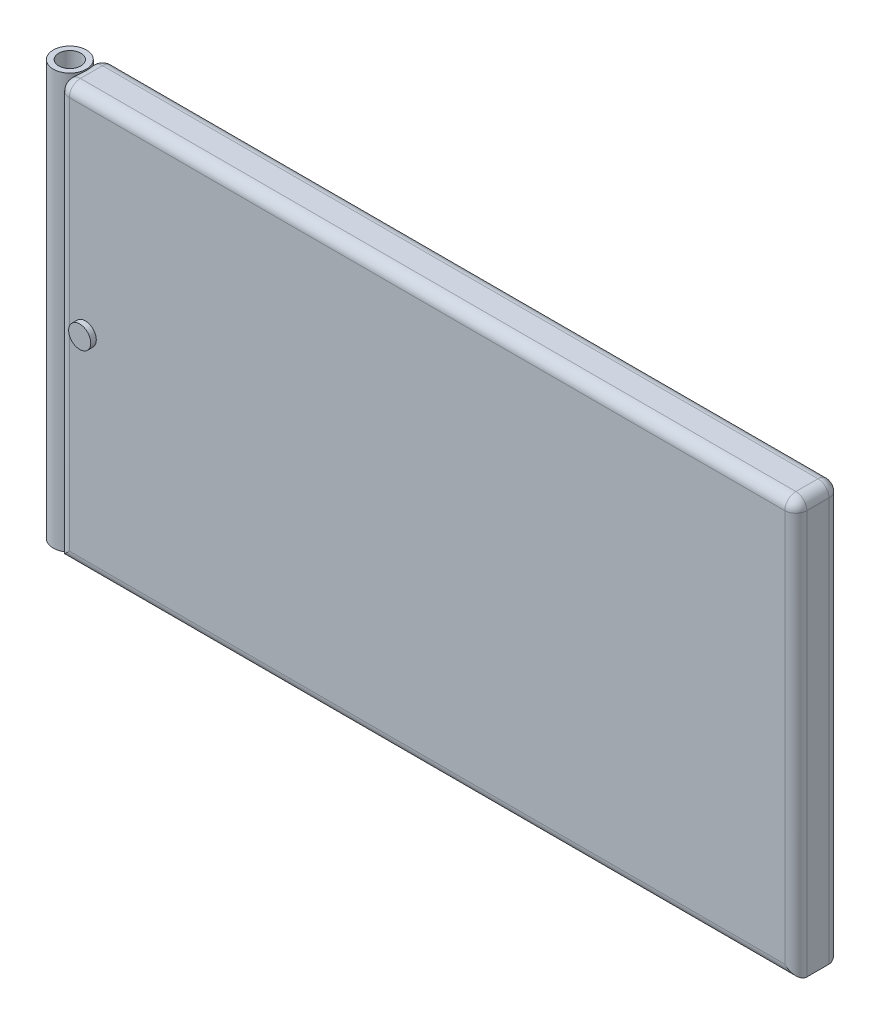
ISO-10303-21;
HEADER;
FILE_DESCRIPTION(('STEP AP214'),'2;1');
FILE_NAME('part.step','',(''),(''),'','','');
FILE_SCHEMA(('AUTOMOTIVE_DESIGN { 1 0 10303 214 1 1 1 1 }'));
ENDSEC;
DATA;
#1=APPLICATION_CONTEXT('core data for automotive mechanical design processes');
#2=APPLICATION_PROTOCOL_DEFINITION('international standard','automotive_design',2000,#1);
#3=PRODUCT_CONTEXT('',#1,'mechanical');
#4=PRODUCT('Part','Part','',(#3));
#5=PRODUCT_RELATED_PRODUCT_CATEGORY('part','',(#4));
#6=PRODUCT_DEFINITION_FORMATION('','',#4);
#7=PRODUCT_DEFINITION_CONTEXT('part definition',#1,'design');
#8=PRODUCT_DEFINITION('design','',#6,#7);
#9=PRODUCT_DEFINITION_SHAPE('','',#8);
#10=(LENGTH_UNIT() NAMED_UNIT(*) SI_UNIT(.MILLI.,.METRE.));
#11=(NAMED_UNIT(*) PLANE_ANGLE_UNIT() SI_UNIT($,.RADIAN.));
#12=(NAMED_UNIT(*) SI_UNIT($,.STERADIAN.) SOLID_ANGLE_UNIT());
#13=UNCERTAINTY_MEASURE_WITH_UNIT(LENGTH_MEASURE(1.E-05),#10,'distance_accuracy_value','');
#14=(GEOMETRIC_REPRESENTATION_CONTEXT(3) GLOBAL_UNCERTAINTY_ASSIGNED_CONTEXT((#13)) GLOBAL_UNIT_ASSIGNED_CONTEXT((#10,
#11,#12)) REPRESENTATION_CONTEXT('',''));
#15=CARTESIAN_POINT('',(0.,0.,0.));
#16=DIRECTION('',(0.,0.,1.));
#17=DIRECTION('',(1.,0.,0.));
#18=AXIS2_PLACEMENT_3D('',#15,#16,#17);
#19=CARTESIAN_POINT('',(-857.185714285714,219.297678571429,20.));
#20=DIRECTION('',(-1.,0.,0.));
#21=DIRECTION('',(0.,0.,1.));
#22=AXIS2_PLACEMENT_3D('',#19,#20,#21);
#23=CYLINDRICAL_SURFACE('',#22,20.);
#24=DIRECTION('',(-1.,0.,0.));
#25=VECTOR('',#24,1.);
#26=CARTESIAN_POINT('',(-857.185714285714,239.297678571429,20.));
#27=LINE('',#26,#25);
#28=CARTESIAN_POINT('',(456.214285714286,239.297678571429,20.));
#29=VERTEX_POINT('',#28);
#30=CARTESIAN_POINT('',(-837.185714285714,239.297678571429,20.));
#31=VERTEX_POINT('',#30);
#32=EDGE_CURVE('E198',#29,#31,#27,.T.);
#33=ORIENTED_EDGE('',*,*,#32,.F.);
#34=CARTESIAN_POINT('',(456.214285714286,219.297678571429,20.));
#35=DIRECTION('',(-1.,0.,0.));
#36=DIRECTION('',(0.,0.,1.));
#37=AXIS2_PLACEMENT_3D('',#34,#35,#36);
#38=CIRCLE('',#37,20.);
#39=CARTESIAN_POINT('',(456.214285714286,219.297678571429,0.));
#40=VERTEX_POINT('',#39);
#41=EDGE_CURVE('E230',#29,#40,#38,.T.);
#42=ORIENTED_EDGE('',*,*,#41,.T.);
#43=DIRECTION('',(-1.,0.,0.));
#44=VECTOR('',#43,1.);
#45=CARTESIAN_POINT('',(0.,219.297678571429,0.));
#46=LINE('',#45,#44);
#47=CARTESIAN_POINT('',(-837.185714285714,219.297678571429,0.));
#48=VERTEX_POINT('',#47);
#49=EDGE_CURVE('E203',#48,#40,#46,.F.);
#50=ORIENTED_EDGE('',*,*,#49,.F.);
#51=CARTESIAN_POINT('',(-837.185714285714,219.297678571429,20.));
#52=DIRECTION('',(-1.,0.,0.));
#53=DIRECTION('',(0.,0.,1.));
#54=AXIS2_PLACEMENT_3D('',#51,#52,#53);
#55=CIRCLE('',#54,20.);
#56=EDGE_CURVE('E228',#48,#31,#55,.F.);
#57=ORIENTED_EDGE('',*,*,#56,.T.);
#58=EDGE_LOOP('',(#33,#42,#50,#57));
#59=FACE_BOUND('',#58,.T.);
#60=ADVANCED_FACE('F41',(#59),#23,.T.);
#61=CARTESIAN_POINT('',(-857.185714285714,-510.702321428571,80.));
#62=DIRECTION('',(0.,1.,0.));
#63=DIRECTION('',(0.,0.,1.));
#64=AXIS2_PLACEMENT_3D('',#61,#62,#63);
#65=PLANE('',#64);
#66=CARTESIAN_POINT('',(-876.240324270766,-510.702321428572,40.));
#67=DIRECTION('',(0.,1.,0.));
#68=DIRECTION('',(0.,0.,1.));
#69=AXIS2_PLACEMENT_3D('',#66,#67,#68);
#70=CIRCLE('',#69,20.0000000000001);
#71=CARTESIAN_POINT('',(-876.240324270766,-510.702321428572,60.0000000000001));
#72=VERTEX_POINT('',#71);
#73=EDGE_CURVE('E304',#72,#72,#70,.T.);
#74=ORIENTED_EDGE('',*,*,#73,.T.);
#75=EDGE_LOOP('',(#74));
#76=FACE_BOUND('',#75,.T.);
#77=DIRECTION('',(1.,0.,0.));
#78=VECTOR('',#77,1.);
#79=CARTESIAN_POINT('',(-857.185714285714,-510.702321428571,60.));
#80=LINE('',#79,#78);
#81=CARTESIAN_POINT('',(476.214285714286,-510.702321428571,60.));
#82=VERTEX_POINT('',#81);
#83=CARTESIAN_POINT('',(-853.879644495769,-510.702321428572,60.));
#84=VERTEX_POINT('',#83);
#85=EDGE_CURVE('E56',#82,#84,#80,.F.);
#86=ORIENTED_EDGE('',*,*,#85,.T.);
#87=CARTESIAN_POINT('',(-876.240324270766,-510.702321428572,40.));
#88=DIRECTION('',(0.,1.,0.));
#89=DIRECTION('',(0.,0.,1.));
#90=AXIS2_PLACEMENT_3D('',#87,#88,#89);
#91=CIRCLE('',#90,30.);
#92=CARTESIAN_POINT('',(-853.879644495769,-510.702321428571,20.));
#93=VERTEX_POINT('',#92);
#94=EDGE_CURVE('E63',#93,#84,#91,.T.);
#95=ORIENTED_EDGE('',*,*,#94,.F.);
#96=DIRECTION('',(1.,0.,0.));
#97=VECTOR('',#96,1.);
#98=CARTESIAN_POINT('',(-857.185714285714,-510.702321428571,20.));
#99=LINE('',#98,#97);
#100=CARTESIAN_POINT('',(476.214285714286,-510.702321428571,20.));
#101=VERTEX_POINT('',#100);
#102=EDGE_CURVE('E159',#93,#101,#99,.T.);
#103=ORIENTED_EDGE('',*,*,#102,.T.);
#104=DIRECTION('',(0.,0.,-1.));
#105=VECTOR('',#104,1.);
#106=CARTESIAN_POINT('',(476.214285714286,-510.702321428571,80.));
#107=LINE('',#106,#105);
#108=EDGE_CURVE('E158',#82,#101,#107,.T.);
#109=ORIENTED_EDGE('',*,*,#108,.F.);
#110=EDGE_LOOP('',(#86,#95,#103,#109));
#111=FACE_BOUND('',#110,.T.);
#112=ADVANCED_FACE('F156',(#76,#111),#65,.F.);
#113=CARTESIAN_POINT('',(476.214285714286,239.297678571429,80.));
#114=DIRECTION('',(-1.,0.,0.));
#115=DIRECTION('',(0.,-1.,0.));
#116=AXIS2_PLACEMENT_3D('',#113,#114,#115);
#117=PLANE('',#116);
#118=ORIENTED_EDGE('',*,*,#108,.T.);
#119=DIRECTION('',(0.,1.,0.));
#120=VECTOR('',#119,1.);
#121=CARTESIAN_POINT('',(476.214285714286,239.297678571429,20.));
#122=LINE('',#121,#120);
#123=CARTESIAN_POINT('',(476.214285714286,219.297678571429,20.));
#124=VERTEX_POINT('',#123);
#125=EDGE_CURVE('E226',#101,#124,#122,.T.);
#126=ORIENTED_EDGE('',*,*,#125,.T.);
#127=DIRECTION('',(0.,0.,-1.));
#128=VECTOR('',#127,1.);
#129=CARTESIAN_POINT('',(476.214285714286,219.297678571429,80.));
#130=LINE('',#129,#128);
#131=CARTESIAN_POINT('',(476.214285714286,219.297678571429,60.));
#132=VERTEX_POINT('',#131);
#133=EDGE_CURVE('E223',#124,#132,#130,.F.);
#134=ORIENTED_EDGE('',*,*,#133,.T.);
#135=DIRECTION('',(0.,1.,0.));
#136=VECTOR('',#135,1.);
#137=CARTESIAN_POINT('',(476.214285714286,-510.702321428571,60.));
#138=LINE('',#137,#136);
#139=EDGE_CURVE('E221',#132,#82,#138,.F.);
#140=ORIENTED_EDGE('',*,*,#139,.T.);
#141=EDGE_LOOP('',(#118,#126,#134,#140));
#142=FACE_BOUND('',#141,.T.);
#143=ADVANCED_FACE('F335',(#142),#117,.F.);
#144=CARTESIAN_POINT('',(-857.185714285714,239.297678571429,80.));
#145=DIRECTION('',(0.,-1.,0.));
#146=DIRECTION('',(0.,0.,-1.));
#147=AXIS2_PLACEMENT_3D('',#144,#145,#146);
#148=PLANE('',#147);
#149=DIRECTION('',(-1.,0.,0.));
#150=VECTOR('',#149,1.);
#151=CARTESIAN_POINT('',(476.214285714286,239.297678571429,60.));
#152=LINE('',#151,#150);
#153=CARTESIAN_POINT('',(-837.185714285714,239.297678571429,60.));
#154=VERTEX_POINT('',#153);
#155=CARTESIAN_POINT('',(456.214285714286,239.297678571429,60.));
#156=VERTEX_POINT('',#155);
#157=EDGE_CURVE('E214',#154,#156,#152,.F.);
#158=ORIENTED_EDGE('',*,*,#157,.T.);
#159=DIRECTION('',(0.,0.,-1.));
#160=VECTOR('',#159,1.);
#161=CARTESIAN_POINT('',(456.214285714286,239.297678571429,80.));
#162=LINE('',#161,#160);
#163=EDGE_CURVE('E218',#156,#29,#162,.T.);
#164=ORIENTED_EDGE('',*,*,#163,.T.);
#165=ORIENTED_EDGE('',*,*,#32,.T.);
#166=DIRECTION('',(0.,0.,-1.));
#167=VECTOR('',#166,1.);
#168=CARTESIAN_POINT('',(-837.185714285714,239.297678571429,80.));
#169=LINE('',#168,#167);
#170=EDGE_CURVE('E216',#31,#154,#169,.F.);
#171=ORIENTED_EDGE('',*,*,#170,.T.);
#172=EDGE_LOOP('',(#158,#164,#165,#171));
#173=FACE_BOUND('',#172,.T.);
#174=ADVANCED_FACE('F328',(#173),#148,.F.);
#175=CARTESIAN_POINT('',(0.,0.,80.));
#176=DIRECTION('',(0.,0.,1.));
#177=DIRECTION('',(1.,0.,0.));
#178=AXIS2_PLACEMENT_3D('',#175,#176,#177);
#179=PLANE('',#178);
#180=CARTESIAN_POINT('',(-808.39323953068,-135.702321428571,80.));
#181=DIRECTION('',(0.,0.,1.));
#182=DIRECTION('',(1.,0.,0.));
#183=AXIS2_PLACEMENT_3D('',#180,#181,#182);
#184=CIRCLE('',#183,20.);
#185=CARTESIAN_POINT('',(-788.39323953068,-135.702321428571,80.));
#186=VERTEX_POINT('',#185);
#187=EDGE_CURVE('E312',#186,#186,#184,.T.);
#188=ORIENTED_EDGE('',*,*,#187,.F.);
#189=EDGE_LOOP('',(#188));
#190=FACE_BOUND('',#189,.T.);
#191=DIRECTION('',(0.,-1.,0.));
#192=VECTOR('',#191,1.);
#193=CARTESIAN_POINT('',(-837.185714285714,-510.702321428571,80.));
#194=LINE('',#193,#192);
#195=CARTESIAN_POINT('',(-837.185714285714,219.297678571429,80.));
#196=VERTEX_POINT('',#195);
#197=CARTESIAN_POINT('',(-837.185714285714,-490.702321428571,80.));
#198=VERTEX_POINT('',#197);
#199=EDGE_CURVE('E243',#196,#198,#194,.T.);
#200=ORIENTED_EDGE('',*,*,#199,.T.);
#201=DIRECTION('',(1.,0.,0.));
#202=VECTOR('',#201,1.);
#203=CARTESIAN_POINT('',(476.214285714286,-490.702321428571,80.));
#204=LINE('',#203,#202);
#205=CARTESIAN_POINT('',(456.214285714286,-490.702321428571,80.));
#206=VERTEX_POINT('',#205);
#207=EDGE_CURVE('E70',#198,#206,#204,.T.);
#208=ORIENTED_EDGE('',*,*,#207,.T.);
#209=DIRECTION('',(0.,1.,0.));
#210=VECTOR('',#209,1.);
#211=CARTESIAN_POINT('',(456.214285714286,239.297678571429,80.));
#212=LINE('',#211,#210);
#213=CARTESIAN_POINT('',(456.214285714286,219.297678571429,80.));
#214=VERTEX_POINT('',#213);
#215=EDGE_CURVE('E245',#206,#214,#212,.T.);
#216=ORIENTED_EDGE('',*,*,#215,.T.);
#217=DIRECTION('',(-1.,0.,0.));
#218=VECTOR('',#217,1.);
#219=CARTESIAN_POINT('',(-857.185714285714,219.297678571429,80.));
#220=LINE('',#219,#218);
#221=EDGE_CURVE('E240',#214,#196,#220,.T.);
#222=ORIENTED_EDGE('',*,*,#221,.T.);
#223=EDGE_LOOP('',(#200,#208,#216,#222));
#224=FACE_BOUND('',#223,.T.);
#225=ADVANCED_FACE('F247',(#190,#224),#179,.T.);
#226=CARTESIAN_POINT('',(0.,0.,0.));
#227=DIRECTION('',(0.,0.,1.));
#228=DIRECTION('',(1.,0.,0.));
#229=AXIS2_PLACEMENT_3D('',#226,#227,#228);
#230=PLANE('',#229);
#231=ORIENTED_EDGE('',*,*,#49,.T.);
#232=DIRECTION('',(0.,1.,0.));
#233=VECTOR('',#232,1.);
#234=CARTESIAN_POINT('',(456.214285714286,1.01299920832584E-13,0.));
#235=LINE('',#234,#233);
#236=CARTESIAN_POINT('',(456.214285714286,-490.702321428571,0.));
#237=VERTEX_POINT('',#236);
#238=EDGE_CURVE('E238',#40,#237,#235,.F.);
#239=ORIENTED_EDGE('',*,*,#238,.T.);
#240=DIRECTION('',(1.,0.,0.));
#241=VECTOR('',#240,1.);
#242=CARTESIAN_POINT('',(0.,-490.702321428571,0.));
#243=LINE('',#242,#241);
#244=CARTESIAN_POINT('',(-837.185714285714,-490.702321428571,0.));
#245=VERTEX_POINT('',#244);
#246=EDGE_CURVE('E232',#237,#245,#243,.F.);
#247=ORIENTED_EDGE('',*,*,#246,.T.);
#248=DIRECTION('',(0.,-1.,0.));
#249=VECTOR('',#248,1.);
#250=CARTESIAN_POINT('',(-837.185714285714,0.,0.));
#251=LINE('',#250,#249);
#252=EDGE_CURVE('E235',#245,#48,#251,.F.);
#253=ORIENTED_EDGE('',*,*,#252,.T.);
#254=EDGE_LOOP('',(#231,#239,#247,#253));
#255=FACE_BOUND('',#254,.T.);
#256=ADVANCED_FACE('F327',(#255),#230,.F.);
#257=CARTESIAN_POINT('',(-837.185714285714,219.297678571429,20.));
#258=DIRECTION('',(1.,0.,0.));
#259=DIRECTION('',(0.,0.,-1.));
#260=AXIS2_PLACEMENT_3D('',#257,#258,#259);
#261=SPHERICAL_SURFACE('',#260,20.);
#262=CARTESIAN_POINT('',(-853.87946561194,230.312153893391,20.0002));
#263=CARTESIAN_POINT('',(-854.08392682883,230.002345111516,19.771663402077));
#264=CARTESIAN_POINT('',(-854.281295179875,229.677278107597,19.5579874412226));
#265=CARTESIAN_POINT('',(-854.659162682009,229.001335543366,19.1594279236898));
#266=CARTESIAN_POINT('',(-854.8396811024,228.650490304345,18.97451131292));
#267=CARTESIAN_POINT('',(-855.180994144091,227.928349666236,18.632674794495));
#268=CARTESIAN_POINT('',(-855.341861784105,227.55713789495,18.4756501914571));
#269=CARTESIAN_POINT('',(-855.642903208779,226.79665600358,18.1873950406077));
#270=CARTESIAN_POINT('',(-855.783071388093,226.407381029408,18.0561714764561));
#271=CARTESIAN_POINT('',(-856.040607025843,225.61607401538,17.818883415855));
#272=CARTESIAN_POINT('',(-856.158075561929,225.214108258057,17.7127068993261));
#273=CARTESIAN_POINT('',(-856.369894430687,224.398783980588,17.5236529808875));
#274=CARTESIAN_POINT('',(-856.464244316449,223.985425240375,17.4407760293798));
#275=CARTESIAN_POINT('',(-856.628976201876,223.150206613877,17.2974242525681));
#276=CARTESIAN_POINT('',(-856.699360515013,222.728347552322,17.2369472648764));
#277=CARTESIAN_POINT('',(-856.815559770523,221.878877900733,17.1377086653997));
#278=CARTESIAN_POINT('',(-856.861383897809,221.451269522218,17.0989389353852));
#279=CARTESIAN_POINT('',(-856.917049179972,220.735278051996,17.0519744594991));
#280=CARTESIAN_POINT('',(-856.933784934679,220.447783330108,17.0379028940584));
#281=CARTESIAN_POINT('',(-856.956067853362,219.872691943098,17.0191924982832));
#282=CARTESIAN_POINT('',(-856.961639698402,219.585096911875,17.0145328599648));
#283=CARTESIAN_POINT('',(-856.961632500496,219.297478571429,17.0145253773848));
#284=B_SPLINE_CURVE_WITH_KNOTS('',3,(#262,#263,#264,#265,#266,#267,#268,#269,#270,#271,#272,
#273,#274,#275,#276,#277,#278,#279,#280,#281,#282,#283),.UNSPECIFIED.,.F.,.F.,(4,2,2,2,2,2,2,2,
2,2,4),(0.,1.30675306160762,2.61199294846357,3.91222490095076,5.21280830886236,6.50745978956174,
7.80213629534773,9.09668778653358,10.3907548085081,11.2553842973599,12.1181001530973),.UNSPECIFIED.);
#285=CARTESIAN_POINT('',(-853.879644495769,230.311882770636,20.));
#286=VERTEX_POINT('',#285);
#287=CARTESIAN_POINT('',(-856.961632501393,219.297678571429,17.0145253766319));
#288=VERTEX_POINT('',#287);
#289=EDGE_CURVE('E296',#286,#288,#284,.T.);
#290=ORIENTED_EDGE('',*,*,#289,.F.);
#291=CARTESIAN_POINT('',(-837.185714285714,219.297678571429,20.));
#292=DIRECTION('',(0.,0.,1.));
#293=DIRECTION('',(1.,0.,0.));
#294=AXIS2_PLACEMENT_3D('',#291,#292,#293);
#295=CIRCLE('',#294,20.);
#296=EDGE_CURVE('E192',#31,#286,#295,.T.);
#297=ORIENTED_EDGE('',*,*,#296,.F.);
#298=ORIENTED_EDGE('',*,*,#56,.F.);
#299=CARTESIAN_POINT('',(-837.185714285714,219.297678571429,20.));
#300=DIRECTION('',(0.,-1.,0.));
#301=DIRECTION('',(0.,0.,-1.));
#302=AXIS2_PLACEMENT_3D('',#299,#300,#301);
#303=CIRCLE('',#302,20.);
#304=EDGE_CURVE('E191',#288,#48,#303,.T.);
#305=ORIENTED_EDGE('',*,*,#304,.F.);
#306=EDGE_LOOP('',(#290,#297,#298,#305));
#307=FACE_BOUND('',#306,.T.);
#308=ADVANCED_FACE('F43',(#307),#261,.T.);
#309=CARTESIAN_POINT('',(-837.185714285714,0.,60.));
#310=DIRECTION('',(0.,1.,0.));
#311=DIRECTION('',(0.,0.,1.));
#312=AXIS2_PLACEMENT_3D('',#309,#310,#311);
#313=CYLINDRICAL_SURFACE('',#312,20.);
#314=DIRECTION('',(0.,1.,0.));
#315=VECTOR('',#314,1.);
#316=CARTESIAN_POINT('',(-856.961632501393,-135.702321428572,62.9854746233682));
#317=LINE('',#316,#315);
#318=CARTESIAN_POINT('',(-856.961632501393,-510.47823964425,62.9854746233682));
#319=VERTEX_POINT('',#318);
#320=CARTESIAN_POINT('',(-856.961632501393,219.297678571429,62.9854746233681));
#321=VERTEX_POINT('',#320);
#322=EDGE_CURVE('E153',#319,#321,#317,.T.);
#323=ORIENTED_EDGE('',*,*,#322,.F.);
#324=CARTESIAN_POINT('',(-837.185714285714,-490.702321428571,60.));
#325=DIRECTION('',(-0.707106781186547,0.707106781186547,0.));
#326=DIRECTION('',(-0.707106781186547,-0.707106781186547,0.));
#327=AXIS2_PLACEMENT_3D('',#324,#325,#326);
#328=ELLIPSE('',#327,28.2842712474619,20.);
#329=EDGE_CURVE('E151',#198,#319,#328,.F.);
#330=ORIENTED_EDGE('',*,*,#329,.F.);
#331=ORIENTED_EDGE('',*,*,#199,.F.);
#332=CARTESIAN_POINT('',(-837.185714285714,219.297678571429,60.));
#333=DIRECTION('',(0.,1.,0.));
#334=DIRECTION('',(0.,0.,1.));
#335=AXIS2_PLACEMENT_3D('',#332,#333,#334);
#336=CIRCLE('',#335,20.);
#337=EDGE_CURVE('E188',#321,#196,#336,.T.);
#338=ORIENTED_EDGE('',*,*,#337,.F.);
#339=EDGE_LOOP('',(#323,#330,#331,#338));
#340=FACE_BOUND('',#339,.T.);
#341=ADVANCED_FACE('F268',(#340),#313,.T.);
#342=CARTESIAN_POINT('',(-837.185714285714,219.297678571429,80.));
#343=DIRECTION('',(0.,0.,-1.));
#344=DIRECTION('',(-1.,0.,0.));
#345=AXIS2_PLACEMENT_3D('',#342,#343,#344);
#346=CYLINDRICAL_SURFACE('',#345,20.);
#347=CARTESIAN_POINT('',(-853.879644495769,230.311882770636,60.));
#348=CARTESIAN_POINT('',(-853.755229656851,230.500461660522,59.8609031293231));
#349=CARTESIAN_POINT('',(-853.629159920713,230.684583063447,59.7173363187234));
#350=CARTESIAN_POINT('',(-853.374512863806,231.043794583285,59.4214510412519));
#351=CARTESIAN_POINT('',(-853.245935847458,231.218885787301,59.2691336325116));
#352=CARTESIAN_POINT('',(-852.857960501575,231.730032871547,58.7997205879196));
#353=CARTESIAN_POINT('',(-852.595968132905,232.052486193325,58.4697770285103));
#354=CARTESIAN_POINT('',(-852.073878131207,232.658113512175,57.7811153478608));
#355=CARTESIAN_POINT('',(-851.813783507136,232.941600513411,57.4226681214549));
#356=CARTESIAN_POINT('',(-851.298811638126,233.473629813734,56.6771163918403));
#357=CARTESIAN_POINT('',(-851.043935616691,233.722163996486,56.2900052643864));
#358=CARTESIAN_POINT('',(-850.545437113586,234.185025519403,55.4917198212825));
#359=CARTESIAN_POINT('',(-850.301774440805,234.399483109576,55.0806457635731));
#360=CARTESIAN_POINT('',(-849.828790932561,234.797620245219,54.2360524183338));
#361=CARTESIAN_POINT('',(-849.599469492097,234.98130108959,53.8025340790534));
#362=CARTESIAN_POINT('',(-849.158108923701,235.320769792764,52.9150956299356));
#363=CARTESIAN_POINT('',(-848.946103948237,235.476503223016,52.4611378178424));
#364=CARTESIAN_POINT('',(-848.542552075784,235.762288097537,51.5363778653397));
#365=CARTESIAN_POINT('',(-848.351006521515,235.892337856702,51.0655746220948));
#366=CARTESIAN_POINT('',(-847.966243035134,236.145235123919,50.0454960742544));
#367=CARTESIAN_POINT('',(-847.776259197106,236.264766440236,49.4941773567156));
#368=CARTESIAN_POINT('',(-847.427612368555,236.477469313901,48.3767716744168));
#369=CARTESIAN_POINT('',(-847.268951438572,236.570639137264,47.8106837408532));
#370=CARTESIAN_POINT('',(-846.984555315579,236.733549261366,46.6668837096736));
#371=CARTESIAN_POINT('',(-846.858826576534,236.803284970305,46.0891693573956));
#372=CARTESIAN_POINT('',(-846.641460909639,236.921643143685,44.9252307529914));
#373=CARTESIAN_POINT('',(-846.549826084931,236.970264305669,44.3390059782019));
#374=CARTESIAN_POINT('',(-846.387738398468,237.055290258634,43.0524104588728));
#375=CARTESIAN_POINT('',(-846.324287730276,237.087799844953,42.3508883821238));
#376=CARTESIAN_POINT('',(-846.246918136544,237.127328582775,40.9443625088603));
#377=CARTESIAN_POINT('',(-846.233004808,237.134344853907,40.2393583279296));
#378=CARTESIAN_POINT('',(-846.254867686562,237.123239639752,38.829608594947));
#379=CARTESIAN_POINT('',(-846.290693121636,237.105093250236,38.1248639906342));
#380=CARTESIAN_POINT('',(-846.411759487248,237.042669686608,36.7207891993374));
#381=CARTESIAN_POINT('',(-846.497000240311,236.998392606344,36.0214589929166));
#382=CARTESIAN_POINT('',(-846.722913258502,236.87776226255,34.5887986035148));
#383=CARTESIAN_POINT('',(-846.866755187826,236.799554566953,33.856121295309));
#384=CARTESIAN_POINT('',(-847.207398732982,236.606757947074,32.4077443868805));
#385=CARTESIAN_POINT('',(-847.404208911724,236.49216313987,31.6920475521158));
#386=CARTESIAN_POINT('',(-847.736497530824,236.288782134496,30.6368819498485));
#387=CARTESIAN_POINT('',(-847.853383494843,236.215776900421,30.2883632154727));
#388=CARTESIAN_POINT('',(-848.098978141455,236.058406350778,29.5981393366127));
#389=CARTESIAN_POINT('',(-848.227685265584,235.974042532007,29.2564333011724));
#390=CARTESIAN_POINT('',(-848.496227015065,235.793086828218,28.580842102263));
#391=CARTESIAN_POINT('',(-848.636058141376,235.69649878271,28.2469545219454));
#392=CARTESIAN_POINT('',(-848.926054023332,235.490148522996,27.587897801676));
#393=CARTESIAN_POINT('',(-849.076217811967,235.3803875409,27.2627278498095));
#394=CARTESIAN_POINT('',(-849.451310289489,235.097403423088,26.4868781442752));
#395=CARTESIAN_POINT('',(-849.68105580524,234.916941551211,26.04111844575));
#396=CARTESIAN_POINT('',(-850.156155779284,234.52471027246,25.1722779798725));
#397=CARTESIAN_POINT('',(-850.401509253407,234.312942838467,24.7491957856675));
#398=CARTESIAN_POINT('',(-850.90299236915,233.856213133842,23.9298529427894));
#399=CARTESIAN_POINT('',(-851.159091786044,233.611340160043,23.5335243003038));
#400=CARTESIAN_POINT('',(-851.677545286763,233.08618602874,22.7697084173929));
#401=CARTESIAN_POINT('',(-851.939896927463,232.80591852379,22.4022101445152));
#402=CARTESIAN_POINT('',(-852.486474758752,232.18454010606,21.6702559050803));
#403=CARTESIAN_POINT('',(-852.770759606517,231.84034585586,21.3084328571122));
#404=CARTESIAN_POINT('',(-853.191878344557,231.291681251351,20.7953539283659));
#405=CARTESIAN_POINT('',(-853.331518166177,231.103170780417,20.6291026350531));
#406=CARTESIAN_POINT('',(-853.607968132486,230.715485350986,20.3068148647767));
#407=CARTESIAN_POINT('',(-853.744777206556,230.516306456211,20.1507822059924));
#408=CARTESIAN_POINT('',(-853.879644495769,230.311882770636,20.));
#409=B_SPLINE_CURVE_WITH_KNOTS('',3,(#347,#348,#349,#350,#351,#352,#353,#354,#355,#356,#357,
#358,#359,#360,#361,#362,#363,#364,#365,#366,#367,#368,#369,#370,#371,#372,#373,#374,#375,#376,
#377,#378,#379,#380,#381,#382,#383,#384,#385,#386,#387,#388,#389,#390,#391,#392,#393,#394,#395,
#396,#397,#398,#399,#400,#401,#402,#403,#404,#405,#406,#407,#408),.UNSPECIFIED.,.F.,.F.,(4,2,2,
2,2,2,2,2,2,2,2,2,2,2,2,2,2,2,2,2,2,2,2,2,2,2,2,2,2,2,4),(0.,0.795756373017453,1.59141672404564,
3.18052846075363,4.75601854826549,6.33187387576237,7.90155291236542,9.47116568556222,
11.0438029215974,12.6165433039993,14.400625431449,16.1848248834936,17.9693737370472,
19.7540326553279,21.8671443436729,23.9804947752204,26.0959383456809,28.2113743185799,
30.4608311239197,32.7106517977936,33.8346360326388,34.9584722970842,36.0819564473745,
37.2053355961072,38.8026119256818,40.3997876375005,41.9927381232017,43.5850760342162,
45.30576424528,46.1680199468247,47.0305960122623),.UNSPECIFIED.);
#410=CARTESIAN_POINT('',(-853.879644495769,230.311882770636,60.));
#411=VERTEX_POINT('',#410);
#412=EDGE_CURVE('E269',#411,#286,#409,.T.);
#413=ORIENTED_EDGE('',*,*,#412,.F.);
#414=CARTESIAN_POINT('',(-837.185714285714,219.297678571429,60.));
#415=DIRECTION('',(0.,0.,1.));
#416=DIRECTION('',(1.,0.,0.));
#417=AXIS2_PLACEMENT_3D('',#414,#415,#416);
#418=CIRCLE('',#417,20.);
#419=EDGE_CURVE('E185',#154,#411,#418,.T.);
#420=ORIENTED_EDGE('',*,*,#419,.F.);
#421=ORIENTED_EDGE('',*,*,#170,.F.);
#422=ORIENTED_EDGE('',*,*,#296,.T.);
#423=EDGE_LOOP('',(#413,#420,#421,#422));
#424=FACE_BOUND('',#423,.T.);
#425=ADVANCED_FACE('F388',(#424),#346,.T.);
#426=CARTESIAN_POINT('',(-837.185714285714,239.297678571429,20.));
#427=DIRECTION('',(0.,-1.,0.));
#428=DIRECTION('',(0.,0.,-1.));
#429=AXIS2_PLACEMENT_3D('',#426,#427,#428);
#430=CYLINDRICAL_SURFACE('',#429,20.);
#431=DIRECTION('',(0.,1.,0.));
#432=VECTOR('',#431,1.);
#433=CARTESIAN_POINT('',(-856.961632501393,-135.702321428572,17.0145253766318));
#434=LINE('',#433,#432);
#435=CARTESIAN_POINT('',(-856.961632501393,-510.47823964425,17.0145253766319));
#436=VERTEX_POINT('',#435);
#437=EDGE_CURVE('E142',#288,#436,#434,.F.);
#438=ORIENTED_EDGE('',*,*,#437,.F.);
#439=ORIENTED_EDGE('',*,*,#304,.T.);
#440=ORIENTED_EDGE('',*,*,#252,.F.);
#441=CARTESIAN_POINT('',(-837.185714285714,-490.702321428571,20.));
#442=DIRECTION('',(0.707106781186547,-0.707106781186547,0.));
#443=DIRECTION('',(0.707106781186547,0.707106781186547,0.));
#444=AXIS2_PLACEMENT_3D('',#441,#442,#443);
#445=ELLIPSE('',#444,28.2842712474619,20.);
#446=EDGE_CURVE('E183',#436,#245,#445,.T.);
#447=ORIENTED_EDGE('',*,*,#446,.F.);
#448=EDGE_LOOP('',(#438,#439,#440,#447));
#449=FACE_BOUND('',#448,.T.);
#450=ADVANCED_FACE('F380',(#449),#430,.T.);
#451=CARTESIAN_POINT('',(0.,-490.702321428571,60.));
#452=DIRECTION('',(-1.,0.,0.));
#453=DIRECTION('',(0.,0.,1.));
#454=AXIS2_PLACEMENT_3D('',#451,#452,#453);
#455=CYLINDRICAL_SURFACE('',#454,20.);
#456=CARTESIAN_POINT('',(-853.879644495769,-510.702321428571,60.));
#457=CARTESIAN_POINT('',(-854.167843841778,-510.702319667657,60.3222410732172));
#458=CARTESIAN_POINT('',(-854.462985403723,-510.694534319049,60.6381785877797));
#459=CARTESIAN_POINT('',(-855.066208620115,-510.665205965175,61.2566009796144));
#460=CARTESIAN_POINT('',(-855.374286131517,-510.643667333797,61.5590901011103));
#461=CARTESIAN_POINT('',(-856.002239864516,-510.588673033005,62.1496173821642));
#462=CARTESIAN_POINT('',(-856.322101310778,-510.555231860384,62.4376726368223));
#463=CARTESIAN_POINT('',(-856.973198068606,-510.478195152648,62.9991891721353));
#464=CARTESIAN_POINT('',(-857.304434187101,-510.434598895847,63.2726494138777));
#465=CARTESIAN_POINT('',(-858.30046713563,-510.293120023813,64.0596688628127));
#466=CARTESIAN_POINT('',(-858.980509264612,-510.183272203797,64.5519793825134));
#467=CARTESIAN_POINT('',(-860.376756668111,-509.943858299606,65.4764277928036));
#468=CARTESIAN_POINT('',(-861.092956611585,-509.814295116587,65.9085745187365));
#469=CARTESIAN_POINT('',(-862.095819068128,-509.631611689919,66.4580470099446));
#470=CARTESIAN_POINT('',(-862.36868269103,-509.581783137778,66.6021191893845));
#471=CARTESIAN_POINT('',(-862.918584315437,-509.481674708347,66.8817101490916));
#472=CARTESIAN_POINT('',(-863.195620963771,-509.43139497941,67.0172316311223));
#473=CARTESIAN_POINT('',(-863.755877739655,-509.330575228354,67.2806736154965));
#474=CARTESIAN_POINT('',(-864.039128872195,-509.280036135282,67.4085284629508));
#475=CARTESIAN_POINT('',(-864.60966351846,-509.179650972181,67.6554582471155));
#476=CARTESIAN_POINT('',(-864.896948288483,-509.129805128142,67.7745303728028));
#477=CARTESIAN_POINT('',(-865.186114285714,-509.080607036801,67.8891455876005));
#478=B_SPLINE_CURVE_WITH_KNOTS('',3,(#456,#457,#458,#459,#460,#461,#462,#463,#464,#465,#466,
#467,#468,#469,#470,#471,#472,#473,#474,#475,#476,#477),.UNSPECIFIED.,.F.,.F.,(4,2,2,2,2,2,2,2,
2,2,4),(0.,1.29667671972152,2.59294126904746,3.88763239518287,5.18241555835914,7.71892949513242,
10.2550705387886,11.192650874562,12.1299334640275,13.0743451948486,14.0190578968281),.UNSPECIFIED.);
#479=EDGE_CURVE('E138',#84,#319,#478,.T.);
#480=ORIENTED_EDGE('',*,*,#479,.F.);
#481=ORIENTED_EDGE('',*,*,#85,.F.);
#482=CARTESIAN_POINT('',(456.214285714286,-490.702321428571,60.));
#483=DIRECTION('',(-0.707106781186547,-0.707106781186548,0.));
#484=DIRECTION('',(-0.707106781186548,0.707106781186547,0.));
#485=AXIS2_PLACEMENT_3D('',#482,#483,#484);
#486=ELLIPSE('',#485,28.2842712474619,20.);
#487=EDGE_CURVE('E181',#206,#82,#486,.F.);
#488=ORIENTED_EDGE('',*,*,#487,.F.);
#489=ORIENTED_EDGE('',*,*,#207,.F.);
#490=ORIENTED_EDGE('',*,*,#329,.T.);
#491=EDGE_LOOP('',(#480,#481,#488,#489,#490));
#492=FACE_BOUND('',#491,.T.);
#493=ADVANCED_FACE('F148',(#492),#455,.T.);
#494=CARTESIAN_POINT('',(-837.185714285714,219.297678571429,60.));
#495=DIRECTION('',(-1.,0.,0.));
#496=DIRECTION('',(0.,0.,1.));
#497=AXIS2_PLACEMENT_3D('',#494,#495,#496);
#498=SPHERICAL_SURFACE('',#497,20.);
#499=CARTESIAN_POINT('',(-856.961632500496,219.297478571429,62.9854746226152));
#500=CARTESIAN_POINT('',(-856.96163482001,219.515764654133,62.9854729478914));
#501=CARTESIAN_POINT('',(-856.958427970102,219.73402895389,62.9827873525348));
#502=CARTESIAN_POINT('',(-856.945606785617,220.170238576965,62.9720259842732));
#503=CARTESIAN_POINT('',(-856.93599237955,220.388183896697,62.9639501512301));
#504=CARTESIAN_POINT('',(-856.897552117972,221.041156593468,62.9316021141781));
#505=CARTESIAN_POINT('',(-856.85912922218,221.475284868841,62.8992093651424));
#506=CARTESIAN_POINT('',(-856.756640524596,222.341467477761,62.812071476894));
#507=CARTESIAN_POINT('',(-856.692388648321,222.773483224706,62.7571640812095));
#508=CARTESIAN_POINT('',(-856.538807970142,223.629427142901,62.6243357148334));
#509=CARTESIAN_POINT('',(-856.449481812229,224.053356161835,62.5464171705371));
#510=CARTESIAN_POINT('',(-856.246345157082,224.891105728801,62.3664759955302));
#511=CARTESIAN_POINT('',(-856.132483058463,225.30490289412,62.2644025196225));
#512=CARTESIAN_POINT('',(-855.88146297777,226.11835940521,62.0351007321258));
#513=CARTESIAN_POINT('',(-855.7443003033,226.518015883627,61.9078673528504));
#514=CARTESIAN_POINT('',(-855.448819024018,227.297831377237,61.6276346226507));
#515=CARTESIAN_POINT('',(-855.290599161523,227.6780705793,61.4747547121858));
#516=CARTESIAN_POINT('',(-854.954431723884,228.416984047879,61.1415872389231));
#517=CARTESIAN_POINT('',(-854.776498581672,228.775673798783,60.9613196923441));
#518=CARTESIAN_POINT('',(-854.477409462572,229.329890929736,60.6495013072503));
#519=CARTESIAN_POINT('',(-854.3617976742,229.533602199708,60.5270673712296));
#520=CARTESIAN_POINT('',(-854.124805316827,229.930802543005,60.2715104969534));
#521=CARTESIAN_POINT('',(-854.00342303885,230.124288551756,60.1383843839716));
#522=CARTESIAN_POINT('',(-853.87946561194,230.312153893391,59.9998));
#523=B_SPLINE_CURVE_WITH_KNOTS('',3,(#499,#500,#501,#502,#503,#504,#505,#506,#507,#508,#509,
#510,#511,#512,#513,#514,#515,#516,#517,#518,#519,#520,#521,#522),.UNSPECIFIED.,.F.,.F.,(4,2,2,
2,2,2,2,2,2,2,2,4),(0.,0.654774290341887,1.30955588604444,2.61922630838953,3.93850582678125,
5.25764628426002,6.57958857595425,7.90179740385398,9.2180112393015,10.5332677083379,
11.325732048608,12.1184325638613),.UNSPECIFIED.);
#524=EDGE_CURVE('E266',#321,#411,#523,.T.);
#525=ORIENTED_EDGE('',*,*,#524,.F.);
#526=ORIENTED_EDGE('',*,*,#337,.T.);
#527=CARTESIAN_POINT('',(-837.185714285714,219.297678571429,60.));
#528=DIRECTION('',(-1.,0.,0.));
#529=DIRECTION('',(0.,0.,1.));
#530=AXIS2_PLACEMENT_3D('',#527,#528,#529);
#531=CIRCLE('',#530,20.);
#532=EDGE_CURVE('E178',#154,#196,#531,.F.);
#533=ORIENTED_EDGE('',*,*,#532,.F.);
#534=ORIENTED_EDGE('',*,*,#419,.T.);
#535=EDGE_LOOP('',(#525,#526,#533,#534));
#536=FACE_BOUND('',#535,.T.);
#537=ADVANCED_FACE('F263',(#536),#498,.T.);
#538=CARTESIAN_POINT('',(-857.185714285714,-490.702321428571,20.));
#539=DIRECTION('',(1.,0.,0.));
#540=DIRECTION('',(0.,0.,-1.));
#541=AXIS2_PLACEMENT_3D('',#538,#539,#540);
#542=CYLINDRICAL_SURFACE('',#541,20.);
#543=CARTESIAN_POINT('',(-865.186114285714,-509.080607036801,12.1108544123996));
#544=CARTESIAN_POINT('',(-864.792141537037,-509.147634642666,12.2670168550984));
#545=CARTESIAN_POINT('',(-864.401705807611,-509.215859860585,12.4314249928581));
#546=CARTESIAN_POINT('',(-863.628268153184,-509.353233738309,12.7765636135702));
#547=CARTESIAN_POINT('',(-863.245266435789,-509.422382423812,12.9572945515666));
#548=CARTESIAN_POINT('',(-862.107009454803,-509.629177288003,13.5241899121072));
#549=CARTESIAN_POINT('',(-861.363517804732,-509.765992259041,13.9346543076369));
#550=CARTESIAN_POINT('',(-859.928540802476,-510.022003466417,14.8084221134076));
#551=CARTESIAN_POINT('',(-859.236261759955,-510.141526825427,15.2703290739206));
#552=CARTESIAN_POINT('',(-857.890433710761,-510.354377821405,16.2518615305312));
#553=CARTESIAN_POINT('',(-857.23684598316,-510.447732009525,16.7714277729069));
#554=CARTESIAN_POINT('',(-856.125972335409,-510.577838647053,17.7331178257538));
#555=CARTESIAN_POINT('',(-855.659491590253,-510.622824697238,18.1635062908358));
#556=CARTESIAN_POINT('',(-854.978372788129,-510.66952746082,18.833233330998));
#557=CARTESIAN_POINT('',(-854.753513492828,-510.681638916489,19.0615273792036));
#558=CARTESIAN_POINT('',(-854.311046680476,-510.698036177403,19.5253917063909));
#559=CARTESIAN_POINT('',(-854.093440588649,-510.702320453437,19.7609633980795));
#560=CARTESIAN_POINT('',(-853.879644495769,-510.702321428571,20.));
#561=B_SPLINE_CURVE_WITH_KNOTS('',3,(#543,#544,#545,#546,#547,#548,#549,#550,#551,#552,#553,
#554,#555,#556,#557,#558,#559,#560),.UNSPECIFIED.,.F.,.F.,(4,2,2,2,2,2,2,2,4),(0.,
1.28697402877252,2.57398394666829,5.15131457033715,7.67066341263761,10.1874468033164,
12.0944672633849,13.0562298549875,14.0181803278953),.UNSPECIFIED.);
#562=EDGE_CURVE('E11',#436,#93,#561,.T.);
#563=ORIENTED_EDGE('',*,*,#562,.F.);
#564=ORIENTED_EDGE('',*,*,#446,.T.);
#565=ORIENTED_EDGE('',*,*,#246,.F.);
#566=CARTESIAN_POINT('',(456.214285714286,-490.702321428571,20.));
#567=DIRECTION('',(0.707106781186547,0.707106781186548,0.));
#568=DIRECTION('',(0.707106781186548,-0.707106781186547,0.));
#569=AXIS2_PLACEMENT_3D('',#566,#567,#568);
#570=ELLIPSE('',#569,28.2842712474619,20.);
#571=EDGE_CURVE('E175',#101,#237,#570,.T.);
#572=ORIENTED_EDGE('',*,*,#571,.F.);
#573=ORIENTED_EDGE('',*,*,#102,.F.);
#574=EDGE_LOOP('',(#563,#564,#565,#572,#573));
#575=FACE_BOUND('',#574,.T.);
#576=ADVANCED_FACE('F368',(#575),#542,.T.);
#577=CARTESIAN_POINT('',(456.214285714286,1.01299920832584E-13,60.));
#578=DIRECTION('',(0.,-1.,0.));
#579=DIRECTION('',(1.,0.,0.));
#580=AXIS2_PLACEMENT_3D('',#577,#578,#579);
#581=CYLINDRICAL_SURFACE('',#580,20.);
#582=ORIENTED_EDGE('',*,*,#487,.T.);
#583=ORIENTED_EDGE('',*,*,#139,.F.);
#584=CARTESIAN_POINT('',(456.214285714286,219.297678571429,60.));
#585=DIRECTION('',(0.,1.,0.));
#586=DIRECTION('',(0.,0.,1.));
#587=AXIS2_PLACEMENT_3D('',#584,#585,#586);
#588=CIRCLE('',#587,20.);
#589=EDGE_CURVE('E172',#214,#132,#588,.T.);
#590=ORIENTED_EDGE('',*,*,#589,.F.);
#591=ORIENTED_EDGE('',*,*,#215,.F.);
#592=EDGE_LOOP('',(#582,#583,#590,#591));
#593=FACE_BOUND('',#592,.T.);
#594=ADVANCED_FACE('F252',(#593),#581,.T.);
#595=CARTESIAN_POINT('',(0.,219.297678571429,60.));
#596=DIRECTION('',(1.,0.,0.));
#597=DIRECTION('',(0.,0.,-1.));
#598=AXIS2_PLACEMENT_3D('',#595,#596,#597);
#599=CYLINDRICAL_SURFACE('',#598,20.);
#600=ORIENTED_EDGE('',*,*,#532,.T.);
#601=ORIENTED_EDGE('',*,*,#221,.F.);
#602=CARTESIAN_POINT('',(456.214285714286,219.297678571429,60.));
#603=DIRECTION('',(1.,0.,0.));
#604=DIRECTION('',(0.,0.,-1.));
#605=AXIS2_PLACEMENT_3D('',#602,#603,#604);
#606=CIRCLE('',#605,20.);
#607=EDGE_CURVE('E170',#156,#214,#606,.T.);
#608=ORIENTED_EDGE('',*,*,#607,.F.);
#609=ORIENTED_EDGE('',*,*,#157,.F.);
#610=EDGE_LOOP('',(#600,#601,#608,#609));
#611=FACE_BOUND('',#610,.T.);
#612=ADVANCED_FACE('F258',(#611),#599,.T.);
#613=CARTESIAN_POINT('',(456.214285714286,239.297678571429,20.));
#614=DIRECTION('',(0.,1.,0.));
#615=DIRECTION('',(-1.,0.,0.));
#616=AXIS2_PLACEMENT_3D('',#613,#614,#615);
#617=CYLINDRICAL_SURFACE('',#616,20.);
#618=ORIENTED_EDGE('',*,*,#571,.T.);
#619=ORIENTED_EDGE('',*,*,#238,.F.);
#620=CARTESIAN_POINT('',(456.214285714286,219.297678571429,20.));
#621=DIRECTION('',(0.,1.,0.));
#622=DIRECTION('',(0.,0.,1.));
#623=AXIS2_PLACEMENT_3D('',#620,#621,#622);
#624=CIRCLE('',#623,20.);
#625=EDGE_CURVE('E167',#124,#40,#624,.T.);
#626=ORIENTED_EDGE('',*,*,#625,.F.);
#627=ORIENTED_EDGE('',*,*,#125,.F.);
#628=EDGE_LOOP('',(#618,#619,#626,#627));
#629=FACE_BOUND('',#628,.T.);
#630=ADVANCED_FACE('F361',(#629),#617,.T.);
#631=CARTESIAN_POINT('',(456.214285714286,219.297678571429,60.));
#632=DIRECTION('',(0.,0.,1.));
#633=DIRECTION('',(1.,0.,0.));
#634=AXIS2_PLACEMENT_3D('',#631,#632,#633);
#635=SPHERICAL_SURFACE('',#634,20.);
#636=ORIENTED_EDGE('',*,*,#607,.T.);
#637=ORIENTED_EDGE('',*,*,#589,.T.);
#638=CARTESIAN_POINT('',(456.214285714286,219.297678571429,60.));
#639=DIRECTION('',(0.,0.,1.));
#640=DIRECTION('',(1.,0.,0.));
#641=AXIS2_PLACEMENT_3D('',#638,#639,#640);
#642=CIRCLE('',#641,20.);
#643=EDGE_CURVE('E165',#156,#132,#642,.F.);
#644=ORIENTED_EDGE('',*,*,#643,.F.);
#645=EDGE_LOOP('',(#636,#637,#644));
#646=FACE_BOUND('',#645,.T.);
#647=ADVANCED_FACE('F357',(#646),#635,.T.);
#648=CARTESIAN_POINT('',(456.214285714286,219.297678571429,20.));
#649=DIRECTION('',(-1.,0.,0.));
#650=DIRECTION('',(0.,-1.,0.));
#651=AXIS2_PLACEMENT_3D('',#648,#649,#650);
#652=SPHERICAL_SURFACE('',#651,20.);
#653=ORIENTED_EDGE('',*,*,#625,.T.);
#654=ORIENTED_EDGE('',*,*,#41,.F.);
#655=CARTESIAN_POINT('',(456.214285714286,219.297678571429,20.));
#656=DIRECTION('',(0.,0.,1.));
#657=DIRECTION('',(1.,0.,0.));
#658=AXIS2_PLACEMENT_3D('',#655,#656,#657);
#659=CIRCLE('',#658,20.);
#660=EDGE_CURVE('E152',#124,#29,#659,.T.);
#661=ORIENTED_EDGE('',*,*,#660,.F.);
#662=EDGE_LOOP('',(#653,#654,#661));
#663=FACE_BOUND('',#662,.T.);
#664=ADVANCED_FACE('F353',(#663),#652,.T.);
#665=CARTESIAN_POINT('',(456.214285714286,219.297678571429,80.));
#666=DIRECTION('',(0.,0.,-1.));
#667=DIRECTION('',(-1.,0.,0.));
#668=AXIS2_PLACEMENT_3D('',#665,#666,#667);
#669=CYLINDRICAL_SURFACE('',#668,20.);
#670=ORIENTED_EDGE('',*,*,#643,.T.);
#671=ORIENTED_EDGE('',*,*,#133,.F.);
#672=ORIENTED_EDGE('',*,*,#660,.T.);
#673=ORIENTED_EDGE('',*,*,#163,.F.);
#674=EDGE_LOOP('',(#670,#671,#672,#673));
#675=FACE_BOUND('',#674,.T.);
#676=ADVANCED_FACE('F350',(#675),#669,.T.);
#677=CARTESIAN_POINT('',(-876.240324270766,-510.702321428572,40.));
#678=DIRECTION('',(0.,1.,0.));
#679=DIRECTION('',(0.,0.,1.));
#680=AXIS2_PLACEMENT_3D('',#677,#678,#679);
#681=CYLINDRICAL_SURFACE('',#680,20.0000000000001);
#682=ORIENTED_EDGE('',*,*,#73,.F.);
#683=EDGE_LOOP('',(#682));
#684=FACE_BOUND('',#683,.T.);
#685=CARTESIAN_POINT('',(-876.240324270766,239.297678571429,40.));
#686=DIRECTION('',(0.,1.,0.));
#687=DIRECTION('',(0.,0.,1.));
#688=AXIS2_PLACEMENT_3D('',#685,#686,#687);
#689=CIRCLE('',#688,20.0000000000001);
#690=CARTESIAN_POINT('',(-876.240324270766,239.297678571429,60.0000000000001));
#691=VERTEX_POINT('',#690);
#692=EDGE_CURVE('E306',#691,#691,#689,.T.);
#693=ORIENTED_EDGE('',*,*,#692,.T.);
#694=EDGE_LOOP('',(#693));
#695=FACE_BOUND('',#694,.T.);
#696=ADVANCED_FACE('F289',(#684,#695),#681,.F.);
#697=CARTESIAN_POINT('',(-876.240324270766,-510.702321428572,40.));
#698=DIRECTION('',(0.,1.,0.));
#699=DIRECTION('',(0.,0.,1.));
#700=AXIS2_PLACEMENT_3D('',#697,#698,#699);
#701=CYLINDRICAL_SURFACE('',#700,30.);
#702=ORIENTED_EDGE('',*,*,#94,.T.);
#703=ORIENTED_EDGE('',*,*,#479,.T.);
#704=ORIENTED_EDGE('',*,*,#322,.T.);
#705=ORIENTED_EDGE('',*,*,#524,.T.);
#706=ORIENTED_EDGE('',*,*,#412,.T.);
#707=ORIENTED_EDGE('',*,*,#289,.T.);
#708=ORIENTED_EDGE('',*,*,#437,.T.);
#709=ORIENTED_EDGE('',*,*,#562,.T.);
#710=EDGE_LOOP('',(#702,#703,#704,#705,#706,#707,#708,#709));
#711=FACE_BOUND('',#710,.T.);
#712=CARTESIAN_POINT('',(-876.240324270766,239.297678571429,40.));
#713=DIRECTION('',(0.,1.,0.));
#714=DIRECTION('',(0.,0.,1.));
#715=AXIS2_PLACEMENT_3D('',#712,#713,#714);
#716=CIRCLE('',#715,30.);
#717=CARTESIAN_POINT('',(-876.240324270766,239.297678571429,70.));
#718=VERTEX_POINT('',#717);
#719=EDGE_CURVE('E143',#718,#718,#716,.T.);
#720=ORIENTED_EDGE('',*,*,#719,.F.);
#721=EDGE_LOOP('',(#720));
#722=FACE_BOUND('',#721,.T.);
#723=ADVANCED_FACE('F136',(#711,#722),#701,.T.);
#724=CARTESIAN_POINT('',(-876.240324270766,239.297678571429,40.));
#725=DIRECTION('',(0.,1.,0.));
#726=DIRECTION('',(0.,0.,1.));
#727=AXIS2_PLACEMENT_3D('',#724,#725,#726);
#728=PLANE('',#727);
#729=ORIENTED_EDGE('',*,*,#692,.F.);
#730=EDGE_LOOP('',(#729));
#731=FACE_BOUND('',#730,.T.);
#732=ORIENTED_EDGE('',*,*,#719,.T.);
#733=EDGE_LOOP('',(#732));
#734=FACE_BOUND('',#733,.T.);
#735=ADVANCED_FACE('F288',(#731,#734),#728,.T.);
#736=CARTESIAN_POINT('',(-808.39323953068,-135.702321428571,90.));
#737=DIRECTION('',(0.,0.,-1.));
#738=DIRECTION('',(-1.,0.,0.));
#739=AXIS2_PLACEMENT_3D('',#736,#737,#738);
#740=CYLINDRICAL_SURFACE('',#739,20.);
#741=CARTESIAN_POINT('',(-808.39323953068,-135.702321428571,90.));
#742=DIRECTION('',(0.,0.,1.));
#743=DIRECTION('',(1.,0.,0.));
#744=AXIS2_PLACEMENT_3D('',#741,#742,#743);
#745=CIRCLE('',#744,20.);
#746=CARTESIAN_POINT('',(-788.39323953068,-135.702321428571,90.));
#747=VERTEX_POINT('',#746);
#748=EDGE_CURVE('E309',#747,#747,#745,.T.);
#749=ORIENTED_EDGE('',*,*,#748,.F.);
#750=EDGE_LOOP('',(#749));
#751=FACE_BOUND('',#750,.T.);
#752=ORIENTED_EDGE('',*,*,#187,.T.);
#753=EDGE_LOOP('',(#752));
#754=FACE_BOUND('',#753,.T.);
#755=ADVANCED_FACE('F320',(#751,#754),#740,.T.);
#756=CARTESIAN_POINT('',(-808.39323953068,-135.702321428571,90.));
#757=DIRECTION('',(0.,0.,1.));
#758=DIRECTION('',(1.,0.,0.));
#759=AXIS2_PLACEMENT_3D('',#756,#757,#758);
#760=PLANE('',#759);
#761=ORIENTED_EDGE('',*,*,#748,.T.);
#762=EDGE_LOOP('',(#761));
#763=FACE_BOUND('',#762,.T.);
#764=ADVANCED_FACE('F318',(#763),#760,.T.);
#765=CLOSED_SHELL('',(#60,#112,#143,#174,#225,#256,#308,#341,#425,#450,#493,#537,#576,#594,#612,
#630,#647,#664,#676,#696,#723,#735,#755,#764));
#766=MANIFOLD_SOLID_BREP('B2',#765);
#767=ADVANCED_BREP_SHAPE_REPRESENTATION('',(#18,#766),#14);
#768=SHAPE_DEFINITION_REPRESENTATION(#9,#767);
ENDSEC;
END-ISO-10303-21;
